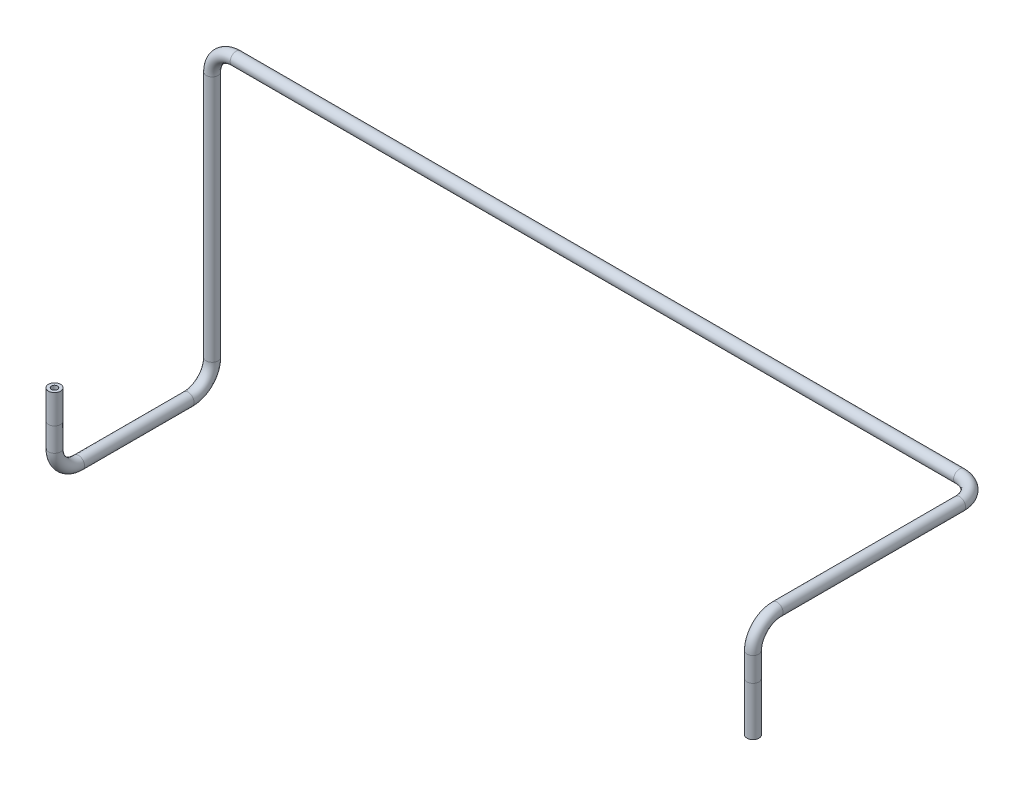
ISO-10303-21;
HEADER;
FILE_DESCRIPTION(('STEP AP214'),'2;1');
FILE_NAME('part.step','',(''),(''),'','','');
FILE_SCHEMA(('AUTOMOTIVE_DESIGN { 1 0 10303 214 1 1 1 1 }'));
ENDSEC;
DATA;
#1=APPLICATION_CONTEXT('core data for automotive mechanical design processes');
#2=APPLICATION_PROTOCOL_DEFINITION('international standard','automotive_design',2000,#1);
#3=PRODUCT_CONTEXT('',#1,'mechanical');
#4=PRODUCT('Part','Part','',(#3));
#5=PRODUCT_RELATED_PRODUCT_CATEGORY('part','',(#4));
#6=PRODUCT_DEFINITION_FORMATION('','',#4);
#7=PRODUCT_DEFINITION_CONTEXT('part definition',#1,'design');
#8=PRODUCT_DEFINITION('design','',#6,#7);
#9=PRODUCT_DEFINITION_SHAPE('','',#8);
#10=(LENGTH_UNIT() NAMED_UNIT(*) SI_UNIT(.MILLI.,.METRE.));
#11=(NAMED_UNIT(*) PLANE_ANGLE_UNIT() SI_UNIT($,.RADIAN.));
#12=(NAMED_UNIT(*) SI_UNIT($,.STERADIAN.) SOLID_ANGLE_UNIT());
#13=UNCERTAINTY_MEASURE_WITH_UNIT(LENGTH_MEASURE(1.E-05),#10,'distance_accuracy_value','');
#14=(GEOMETRIC_REPRESENTATION_CONTEXT(3) GLOBAL_UNCERTAINTY_ASSIGNED_CONTEXT((#13)) GLOBAL_UNIT_ASSIGNED_CONTEXT((#10,
#11,#12)) REPRESENTATION_CONTEXT('',''));
#15=CARTESIAN_POINT('',(0.,0.,0.));
#16=DIRECTION('',(0.,0.,1.));
#17=DIRECTION('',(1.,0.,0.));
#18=AXIS2_PLACEMENT_3D('',#15,#16,#17);
#19=CARTESIAN_POINT('',(5.78025894889841,28.154827009601,76.4051628992786));
#20=DIRECTION('',(0.,1.,0.));
#21=DIRECTION('',(0.,0.,1.));
#22=AXIS2_PLACEMENT_3D('',#19,#20,#21);
#23=CYLINDRICAL_SURFACE('',#22,1.58750000000001);
#24=CARTESIAN_POINT('',(5.78025894889841,41.021,76.4051628992786));
#25=DIRECTION('',(0.,1.,0.));
#26=DIRECTION('',(1.,0.,0.));
#27=AXIS2_PLACEMENT_3D('',#24,#25,#26);
#28=CIRCLE('',#27,1.58750000000001);
#29=CARTESIAN_POINT('',(7.36775894889842,41.021,76.4051628992786));
#30=VERTEX_POINT('',#29);
#31=EDGE_CURVE('E61',#30,#30,#28,.T.);
#32=ORIENTED_EDGE('',*,*,#31,.F.);
#33=EDGE_LOOP('',(#32));
#34=FACE_BOUND('',#33,.T.);
#35=CARTESIAN_POINT('',(5.78025894889841,28.154827009601,76.4051628992786));
#36=DIRECTION('',(0.,1.,0.));
#37=DIRECTION('',(1.,0.,0.));
#38=AXIS2_PLACEMENT_3D('',#35,#36,#37);
#39=CIRCLE('',#38,1.58750000000001);
#40=CARTESIAN_POINT('',(7.36775894889842,28.154827009601,76.4051628992786));
#41=VERTEX_POINT('',#40);
#42=EDGE_CURVE('E58',#41,#41,#39,.T.);
#43=ORIENTED_EDGE('',*,*,#42,.T.);
#44=EDGE_LOOP('',(#43));
#45=FACE_BOUND('',#44,.T.);
#46=ADVANCED_FACE('F37',(#34,#45),#23,.T.);
#47=CARTESIAN_POINT('',(5.78025894889841,41.021,76.4051628992786));
#48=DIRECTION('',(0.,1.,0.));
#49=DIRECTION('',(0.,0.,1.));
#50=AXIS2_PLACEMENT_3D('',#47,#48,#49);
#51=CYLINDRICAL_SURFACE('',#50,1.58750000000001);
#52=CARTESIAN_POINT('',(5.78025894889841,47.3856893309066,76.4051628992786));
#53=DIRECTION('',(0.,1.,0.));
#54=DIRECTION('',(1.,0.,0.));
#55=AXIS2_PLACEMENT_3D('',#52,#53,#54);
#56=CIRCLE('',#55,1.58750000000001);
#57=CARTESIAN_POINT('',(5.78025894889841,47.3856893309066,77.9926628992786));
#58=VERTEX_POINT('',#57);
#59=EDGE_CURVE('E64',#58,#58,#56,.T.);
#60=ORIENTED_EDGE('',*,*,#59,.F.);
#61=EDGE_LOOP('',(#60));
#62=FACE_BOUND('',#61,.T.);
#63=ORIENTED_EDGE('',*,*,#31,.T.);
#64=EDGE_LOOP('',(#63));
#65=FACE_BOUND('',#64,.T.);
#66=ADVANCED_FACE('F133',(#62,#65),#51,.T.);
#67=CARTESIAN_POINT('',(5.78025894889841,47.3856893309066,70.0551628992786));
#68=DIRECTION('',(-1.,0.,0.));
#69=DIRECTION('',(0.,0.,1.));
#70=AXIS2_PLACEMENT_3D('',#67,#68,#69);
#71=TOROIDAL_SURFACE('',#70,6.34999999999999,1.58750000000001);
#72=CARTESIAN_POINT('',(5.78025894889841,53.7356893309066,70.0551628992786));
#73=DIRECTION('',(0.,0.,-1.));
#74=DIRECTION('',(1.,0.,0.));
#75=AXIS2_PLACEMENT_3D('',#72,#73,#74);
#76=CIRCLE('',#75,1.58750000000001);
#77=CARTESIAN_POINT('',(5.78025894889841,55.3231893309066,70.0551628992786));
#78=VERTEX_POINT('',#77);
#79=EDGE_CURVE('E67',#78,#78,#76,.T.);
#80=CARTESIAN_POINT('',(5.78025894889841,47.3856893309066,70.0551628992786));
#81=DIRECTION('',(-1.,0.,0.));
#82=DIRECTION('',(0.,0.,1.));
#83=AXIS2_PLACEMENT_3D('',#80,#81,#82);
#84=CIRCLE('',#83,7.93750000000001);
#85=EDGE_CURVE('',#58,#78,#84,.T.);
#86=ORIENTED_EDGE('',*,*,#59,.T.);
#87=ORIENTED_EDGE('',*,*,#79,.F.);
#88=ORIENTED_EDGE('',*,*,#85,.T.);
#89=ORIENTED_EDGE('',*,*,#85,.F.);
#90=EDGE_LOOP('',(#86,#88,#87,#89));
#91=FACE_BOUND('',#90,.T.);
#92=ADVANCED_FACE('F137',(#91),#71,.T.);
#93=CARTESIAN_POINT('',(5.78025894889841,53.7356893309066,70.0551628992786));
#94=DIRECTION('',(0.,0.,-1.));
#95=DIRECTION('',(-1.,0.,0.));
#96=AXIS2_PLACEMENT_3D('',#93,#94,#95);
#97=CYLINDRICAL_SURFACE('',#96,1.58750000000001);
#98=CARTESIAN_POINT('',(5.78025894889841,53.7356893309066,21.8449999872787));
#99=DIRECTION('',(0.,0.,-1.));
#100=DIRECTION('',(1.,0.,0.));
#101=AXIS2_PLACEMENT_3D('',#98,#99,#100);
#102=CIRCLE('',#101,1.58750000000001);
#103=CARTESIAN_POINT('',(7.36775894889842,53.7356893309066,21.8449999872787));
#104=VERTEX_POINT('',#103);
#105=EDGE_CURVE('E70',#104,#104,#102,.T.);
#106=ORIENTED_EDGE('',*,*,#105,.F.);
#107=EDGE_LOOP('',(#106));
#108=FACE_BOUND('',#107,.T.);
#109=ORIENTED_EDGE('',*,*,#79,.T.);
#110=EDGE_LOOP('',(#109));
#111=FACE_BOUND('',#110,.T.);
#112=ADVANCED_FACE('F141',(#108,#111),#97,.T.);
#113=CARTESIAN_POINT('',(-0.569741051101594,53.7356893309066,21.8449999872787));
#114=DIRECTION('',(0.,1.,0.));
#115=DIRECTION('',(0.,0.,1.));
#116=AXIS2_PLACEMENT_3D('',#113,#114,#115);
#117=TOROIDAL_SURFACE('',#116,6.35,1.58750000000001);
#118=CARTESIAN_POINT('',(-0.569741051101607,53.7356893309066,15.4949999872787));
#119=DIRECTION('',(-1.,0.,0.));
#120=DIRECTION('',(0.,0.,-1.));
#121=AXIS2_PLACEMENT_3D('',#118,#119,#120);
#122=CIRCLE('',#121,1.58750000000001);
#123=CARTESIAN_POINT('',(-0.56974105110161,53.7356893309066,13.9074999872787));
#124=VERTEX_POINT('',#123);
#125=EDGE_CURVE('E73',#124,#124,#122,.T.);
#126=CARTESIAN_POINT('',(-0.569741051101594,53.7356893309066,21.8449999872787));
#127=DIRECTION('',(0.,1.,0.));
#128=DIRECTION('',(0.,0.,1.));
#129=AXIS2_PLACEMENT_3D('',#126,#127,#128);
#130=CIRCLE('',#129,7.93750000000001);
#131=EDGE_CURVE('',#104,#124,#130,.T.);
#132=ORIENTED_EDGE('',*,*,#105,.T.);
#133=ORIENTED_EDGE('',*,*,#125,.F.);
#134=ORIENTED_EDGE('',*,*,#131,.T.);
#135=ORIENTED_EDGE('',*,*,#131,.F.);
#136=EDGE_LOOP('',(#132,#134,#133,#135));
#137=FACE_BOUND('',#136,.T.);
#138=ADVANCED_FACE('F145',(#137),#117,.T.);
#139=CARTESIAN_POINT('',(-0.569741051101608,53.7356893309066,15.4949999872787));
#140=DIRECTION('',(-1.,0.,0.));
#141=DIRECTION('',(0.,0.,1.));
#142=AXIS2_PLACEMENT_3D('',#139,#140,#141);
#143=CYLINDRICAL_SURFACE('',#142,1.58750000000001);
#144=CARTESIAN_POINT('',(-191.589741051102,53.7356893309066,15.4949999872787));
#145=DIRECTION('',(-1.,0.,0.));
#146=DIRECTION('',(0.,0.,-1.));
#147=AXIS2_PLACEMENT_3D('',#144,#145,#146);
#148=CIRCLE('',#147,1.58750000000001);
#149=CARTESIAN_POINT('',(-191.589741051102,55.3231893309067,15.4949999872787));
#150=VERTEX_POINT('',#149);
#151=EDGE_CURVE('E76',#150,#150,#148,.T.);
#152=ORIENTED_EDGE('',*,*,#151,.F.);
#153=EDGE_LOOP('',(#152));
#154=FACE_BOUND('',#153,.T.);
#155=ORIENTED_EDGE('',*,*,#125,.T.);
#156=EDGE_LOOP('',(#155));
#157=FACE_BOUND('',#156,.T.);
#158=ADVANCED_FACE('F149',(#154,#157),#143,.T.);
#159=CARTESIAN_POINT('',(-191.589741051102,47.3856893309066,15.4949999872787));
#160=DIRECTION('',(0.,0.,1.));
#161=DIRECTION('',(1.,0.,0.));
#162=AXIS2_PLACEMENT_3D('',#159,#160,#161);
#163=TOROIDAL_SURFACE('',#162,6.35,1.58750000000001);
#164=CARTESIAN_POINT('',(-197.939741051102,47.3856893309066,15.4949999872787));
#165=DIRECTION('',(0.,-1.,0.));
#166=DIRECTION('',(0.,0.,-1.));
#167=AXIS2_PLACEMENT_3D('',#164,#165,#166);
#168=CIRCLE('',#167,1.58750000000001);
#169=CARTESIAN_POINT('',(-199.527241051102,47.3856893309066,15.4949999872787));
#170=VERTEX_POINT('',#169);
#171=EDGE_CURVE('E79',#170,#170,#168,.T.);
#172=CARTESIAN_POINT('',(-191.589741051102,47.3856893309066,15.4949999872787));
#173=DIRECTION('',(0.,0.,1.));
#174=DIRECTION('',(1.,0.,0.));
#175=AXIS2_PLACEMENT_3D('',#172,#173,#174);
#176=CIRCLE('',#175,7.93750000000001);
#177=EDGE_CURVE('',#150,#170,#176,.T.);
#178=ORIENTED_EDGE('',*,*,#151,.T.);
#179=ORIENTED_EDGE('',*,*,#171,.F.);
#180=ORIENTED_EDGE('',*,*,#177,.T.);
#181=ORIENTED_EDGE('',*,*,#177,.F.);
#182=EDGE_LOOP('',(#178,#180,#179,#181));
#183=FACE_BOUND('',#182,.T.);
#184=ADVANCED_FACE('F153',(#183),#163,.T.);
#185=CARTESIAN_POINT('',(-197.939741051102,47.3856893309066,15.4949999872787));
#186=DIRECTION('',(0.,-1.,0.));
#187=DIRECTION('',(0.,0.,-1.));
#188=AXIS2_PLACEMENT_3D('',#185,#186,#187);
#189=CYLINDRICAL_SURFACE('',#188,1.58750000000001);
#190=CARTESIAN_POINT('',(-197.939741051102,-17.8782461919388,15.4949999872787));
#191=DIRECTION('',(0.,-1.,0.));
#192=DIRECTION('',(0.,0.,-1.));
#193=AXIS2_PLACEMENT_3D('',#190,#191,#192);
#194=CIRCLE('',#193,1.58750000000001);
#195=CARTESIAN_POINT('',(-197.939741051102,-17.8782461919388,13.9074999872787));
#196=VERTEX_POINT('',#195);
#197=EDGE_CURVE('E82',#196,#196,#194,.T.);
#198=ORIENTED_EDGE('',*,*,#197,.F.);
#199=EDGE_LOOP('',(#198));
#200=FACE_BOUND('',#199,.T.);
#201=ORIENTED_EDGE('',*,*,#171,.T.);
#202=EDGE_LOOP('',(#201));
#203=FACE_BOUND('',#202,.T.);
#204=ADVANCED_FACE('F157',(#200,#203),#189,.T.);
#205=CARTESIAN_POINT('',(-197.939741051102,-17.8782461919388,21.8449999872787));
#206=DIRECTION('',(-1.,0.,0.));
#207=DIRECTION('',(0.,0.,1.));
#208=AXIS2_PLACEMENT_3D('',#205,#206,#207);
#209=TOROIDAL_SURFACE('',#208,6.35000000000001,1.58750000000001);
#210=CARTESIAN_POINT('',(-197.939741051102,-24.2282461919388,21.8449999872787));
#211=DIRECTION('',(0.,0.,1.));
#212=DIRECTION('',(0.,-1.,0.));
#213=AXIS2_PLACEMENT_3D('',#210,#211,#212);
#214=CIRCLE('',#213,1.58750000000001);
#215=CARTESIAN_POINT('',(-197.939741051102,-25.8157461919388,21.8449999872787));
#216=VERTEX_POINT('',#215);
#217=EDGE_CURVE('E85',#216,#216,#214,.T.);
#218=CARTESIAN_POINT('',(-197.939741051102,-17.8782461919388,21.8449999872787));
#219=DIRECTION('',(-1.,0.,0.));
#220=DIRECTION('',(0.,0.,1.));
#221=AXIS2_PLACEMENT_3D('',#218,#219,#220);
#222=CIRCLE('',#221,7.93750000000002);
#223=EDGE_CURVE('',#196,#216,#222,.T.);
#224=ORIENTED_EDGE('',*,*,#197,.T.);
#225=ORIENTED_EDGE('',*,*,#217,.F.);
#226=ORIENTED_EDGE('',*,*,#223,.T.);
#227=ORIENTED_EDGE('',*,*,#223,.F.);
#228=EDGE_LOOP('',(#224,#226,#225,#227));
#229=FACE_BOUND('',#228,.T.);
#230=ADVANCED_FACE('F161',(#229),#209,.T.);
#231=CARTESIAN_POINT('',(-197.939741051102,-24.2282461919388,21.8449999872787));
#232=DIRECTION('',(0.,0.,1.));
#233=DIRECTION('',(1.,0.,0.));
#234=AXIS2_PLACEMENT_3D('',#231,#232,#233);
#235=CYLINDRICAL_SURFACE('',#234,1.58750000000001);
#236=CARTESIAN_POINT('',(-197.939741051102,-24.2282461919388,50.7648628992787));
#237=DIRECTION('',(0.,0.,1.));
#238=DIRECTION('',(0.,-1.,0.));
#239=AXIS2_PLACEMENT_3D('',#236,#237,#238);
#240=CIRCLE('',#239,1.58750000000001);
#241=CARTESIAN_POINT('',(-197.939741051102,-25.8157461919388,50.7648628992787));
#242=VERTEX_POINT('',#241);
#243=EDGE_CURVE('E88',#242,#242,#240,.T.);
#244=ORIENTED_EDGE('',*,*,#243,.F.);
#245=EDGE_LOOP('',(#244));
#246=FACE_BOUND('',#245,.T.);
#247=ORIENTED_EDGE('',*,*,#217,.T.);
#248=EDGE_LOOP('',(#247));
#249=FACE_BOUND('',#248,.T.);
#250=ADVANCED_FACE('F107',(#246,#249),#235,.T.);
#251=CARTESIAN_POINT('',(-197.939741051102,-17.8782461919388,50.7648628992787));
#252=DIRECTION('',(-1.,0.,0.));
#253=DIRECTION('',(0.,0.,1.));
#254=AXIS2_PLACEMENT_3D('',#251,#252,#253);
#255=TOROIDAL_SURFACE('',#254,6.35,1.58750000000001);
#256=CARTESIAN_POINT('',(-197.939741051102,-17.8782461919393,57.1148628992787));
#257=DIRECTION('',(0.,1.,0.));
#258=DIRECTION('',(0.,0.,1.));
#259=AXIS2_PLACEMENT_3D('',#256,#257,#258);
#260=CIRCLE('',#259,1.58750000000001);
#261=CARTESIAN_POINT('',(-197.939741051102,-17.8782461919394,58.7023628992787));
#262=VERTEX_POINT('',#261);
#263=EDGE_CURVE('E90',#262,#262,#260,.T.);
#264=CARTESIAN_POINT('',(-197.939741051102,-17.8782461919388,50.7648628992787));
#265=DIRECTION('',(-1.,0.,0.));
#266=DIRECTION('',(0.,0.,1.));
#267=AXIS2_PLACEMENT_3D('',#264,#265,#266);
#268=CIRCLE('',#267,7.93750000000001);
#269=EDGE_CURVE('',#242,#262,#268,.T.);
#270=ORIENTED_EDGE('',*,*,#243,.T.);
#271=ORIENTED_EDGE('',*,*,#263,.F.);
#272=ORIENTED_EDGE('',*,*,#269,.T.);
#273=ORIENTED_EDGE('',*,*,#269,.F.);
#274=EDGE_LOOP('',(#270,#272,#271,#273));
#275=FACE_BOUND('',#274,.T.);
#276=ADVANCED_FACE('F100',(#275),#255,.T.);
#277=CARTESIAN_POINT('',(-197.939741051102,-17.8782461919399,57.1148628992787));
#278=DIRECTION('',(0.,1.,0.));
#279=DIRECTION('',(0.,0.,1.));
#280=AXIS2_PLACEMENT_3D('',#277,#278,#279);
#281=CYLINDRICAL_SURFACE('',#280,1.58750000000001);
#282=CARTESIAN_POINT('',(-197.939741051101,-11.6150000000012,57.1148628992788));
#283=DIRECTION('',(0.,1.,0.));
#284=DIRECTION('',(0.,0.,1.));
#285=AXIS2_PLACEMENT_3D('',#282,#283,#284);
#286=CIRCLE('',#285,1.58750000000001);
#287=CARTESIAN_POINT('',(-197.939741051101,-11.6150000000012,58.7023628992788));
#288=VERTEX_POINT('',#287);
#289=EDGE_CURVE('E41',#288,#288,#286,.T.);
#290=ORIENTED_EDGE('',*,*,#289,.F.);
#291=EDGE_LOOP('',(#290));
#292=FACE_BOUND('',#291,.T.);
#293=ORIENTED_EDGE('',*,*,#263,.T.);
#294=EDGE_LOOP('',(#293));
#295=FACE_BOUND('',#294,.T.);
#296=ADVANCED_FACE('F98',(#292,#295),#281,.T.);
#297=CARTESIAN_POINT('',(-197.939741051102,-11.615,57.1148628992787));
#298=DIRECTION('',(0.,1.,0.));
#299=DIRECTION('',(0.,0.,1.));
#300=AXIS2_PLACEMENT_3D('',#297,#298,#299);
#301=CYLINDRICAL_SURFACE('',#300,1.58750000000001);
#302=CARTESIAN_POINT('',(-197.939741051102,-3.99500000000002,57.1148628992787));
#303=DIRECTION('',(0.,1.,0.));
#304=DIRECTION('',(0.,0.,1.));
#305=AXIS2_PLACEMENT_3D('',#302,#303,#304);
#306=CIRCLE('',#305,1.58750000000001);
#307=CARTESIAN_POINT('',(-197.939741051102,-3.99500000000001,58.7023628992787));
#308=VERTEX_POINT('',#307);
#309=EDGE_CURVE('E54',#308,#308,#306,.T.);
#310=ORIENTED_EDGE('',*,*,#309,.F.);
#311=EDGE_LOOP('',(#310));
#312=FACE_BOUND('',#311,.T.);
#313=ORIENTED_EDGE('',*,*,#289,.T.);
#314=EDGE_LOOP('',(#313));
#315=FACE_BOUND('',#314,.T.);
#316=ADVANCED_FACE('F39',(#312,#315),#301,.T.);
#317=CARTESIAN_POINT('',(5.78025894889841,28.154827009601,76.4051628992786));
#318=DIRECTION('',(0.,1.,0.));
#319=DIRECTION('',(1.,0.,0.));
#320=AXIS2_PLACEMENT_3D('',#317,#318,#319);
#321=PLANE('',#320);
#322=CARTESIAN_POINT('',(5.78025894889841,28.154827009601,76.4051628992786));
#323=DIRECTION('',(0.,1.,0.));
#324=DIRECTION('',(1.,0.,0.));
#325=AXIS2_PLACEMENT_3D('',#322,#323,#324);
#326=CIRCLE('',#325,0.800100000000007);
#327=CARTESIAN_POINT('',(6.58035894889841,28.154827009601,76.4051628992786));
#328=VERTEX_POINT('',#327);
#329=EDGE_CURVE('E57',#328,#328,#326,.F.);
#330=ORIENTED_EDGE('',*,*,#329,.F.);
#331=EDGE_LOOP('',(#330));
#332=FACE_BOUND('',#331,.T.);
#333=ORIENTED_EDGE('',*,*,#42,.F.);
#334=EDGE_LOOP('',(#333));
#335=FACE_BOUND('',#334,.T.);
#336=ADVANCED_FACE('F105',(#332,#335),#321,.F.);
#337=CARTESIAN_POINT('',(-197.939741051102,-3.99500000000002,57.1148628992787));
#338=DIRECTION('',(0.,1.,0.));
#339=DIRECTION('',(0.,0.,1.));
#340=AXIS2_PLACEMENT_3D('',#337,#338,#339);
#341=PLANE('',#340);
#342=CARTESIAN_POINT('',(-197.939741051102,-3.99500000000002,57.1148628992787));
#343=DIRECTION('',(0.,1.,0.));
#344=DIRECTION('',(0.,0.,1.));
#345=AXIS2_PLACEMENT_3D('',#342,#343,#344);
#346=CIRCLE('',#345,0.800100000000007);
#347=CARTESIAN_POINT('',(-197.939741051102,-3.99500000000001,57.9149628992787));
#348=VERTEX_POINT('',#347);
#349=EDGE_CURVE('E10',#348,#348,#346,.F.);
#350=ORIENTED_EDGE('',*,*,#349,.T.);
#351=EDGE_LOOP('',(#350));
#352=FACE_BOUND('',#351,.T.);
#353=ORIENTED_EDGE('',*,*,#309,.T.);
#354=EDGE_LOOP('',(#353));
#355=FACE_BOUND('',#354,.T.);
#356=ADVANCED_FACE('F124',(#352,#355),#341,.T.);
#357=CARTESIAN_POINT('',(5.78025894889841,28.154827009601,76.4051628992786));
#358=DIRECTION('',(0.,1.,0.));
#359=DIRECTION('',(0.,0.,1.));
#360=AXIS2_PLACEMENT_3D('',#357,#358,#359);
#361=CYLINDRICAL_SURFACE('',#360,0.800100000000007);
#362=CARTESIAN_POINT('',(5.78025894889841,41.021,76.4051628992786));
#363=DIRECTION('',(0.,1.,0.));
#364=DIRECTION('',(1.,0.,0.));
#365=AXIS2_PLACEMENT_3D('',#362,#363,#364);
#366=CIRCLE('',#365,0.800100000000007);
#367=CARTESIAN_POINT('',(6.58035894889841,41.021,76.4051628992786));
#368=VERTEX_POINT('',#367);
#369=EDGE_CURVE('E374',#368,#368,#366,.F.);
#370=ORIENTED_EDGE('',*,*,#369,.F.);
#371=EDGE_LOOP('',(#370));
#372=FACE_BOUND('',#371,.T.);
#373=ORIENTED_EDGE('',*,*,#329,.T.);
#374=EDGE_LOOP('',(#373));
#375=FACE_BOUND('',#374,.T.);
#376=ADVANCED_FACE('F127',(#372,#375),#361,.F.);
#377=CARTESIAN_POINT('',(5.78025894889841,41.021,76.4051628992786));
#378=DIRECTION('',(0.,1.,0.));
#379=DIRECTION('',(0.,0.,1.));
#380=AXIS2_PLACEMENT_3D('',#377,#378,#379);
#381=CYLINDRICAL_SURFACE('',#380,0.800100000000007);
#382=CARTESIAN_POINT('',(5.78025894889841,47.3856893309066,76.4051628992786));
#383=DIRECTION('',(0.,1.,0.));
#384=DIRECTION('',(1.,0.,0.));
#385=AXIS2_PLACEMENT_3D('',#382,#383,#384);
#386=CIRCLE('',#385,0.800100000000007);
#387=CARTESIAN_POINT('',(5.78025894889841,47.3856893309066,77.2052628992786));
#388=VERTEX_POINT('',#387);
#389=EDGE_CURVE('E371',#388,#388,#386,.F.);
#390=ORIENTED_EDGE('',*,*,#389,.F.);
#391=EDGE_LOOP('',(#390));
#392=FACE_BOUND('',#391,.T.);
#393=ORIENTED_EDGE('',*,*,#369,.T.);
#394=EDGE_LOOP('',(#393));
#395=FACE_BOUND('',#394,.T.);
#396=ADVANCED_FACE('F230',(#392,#395),#381,.F.);
#397=CARTESIAN_POINT('',(5.78025894889841,47.3856893309066,70.0551628992786));
#398=DIRECTION('',(-1.,0.,0.));
#399=DIRECTION('',(0.,0.,1.));
#400=AXIS2_PLACEMENT_3D('',#397,#398,#399);
#401=TOROIDAL_SURFACE('',#400,6.34999999999999,0.800100000000007);
#402=CARTESIAN_POINT('',(5.78025894889841,53.7356893309066,70.0551628992786));
#403=DIRECTION('',(0.,0.,-1.));
#404=DIRECTION('',(1.,0.,0.));
#405=AXIS2_PLACEMENT_3D('',#402,#403,#404);
#406=CIRCLE('',#405,0.800100000000007);
#407=CARTESIAN_POINT('',(5.78025894889841,54.5357893309066,70.0551628992786));
#408=VERTEX_POINT('',#407);
#409=EDGE_CURVE('E368',#408,#408,#406,.F.);
#410=CARTESIAN_POINT('',(5.78025894889841,47.3856893309066,70.0551628992786));
#411=DIRECTION('',(-1.,0.,0.));
#412=DIRECTION('',(0.,0.,1.));
#413=AXIS2_PLACEMENT_3D('',#410,#411,#412);
#414=CIRCLE('',#413,7.1501);
#415=EDGE_CURVE('',#388,#408,#414,.T.);
#416=ORIENTED_EDGE('',*,*,#389,.T.);
#417=ORIENTED_EDGE('',*,*,#409,.F.);
#418=ORIENTED_EDGE('',*,*,#415,.T.);
#419=ORIENTED_EDGE('',*,*,#415,.F.);
#420=EDGE_LOOP('',(#416,#418,#417,#419));
#421=FACE_BOUND('',#420,.T.);
#422=ADVANCED_FACE('F240',(#421),#401,.F.);
#423=CARTESIAN_POINT('',(5.78025894889841,53.7356893309066,70.0551628992786));
#424=DIRECTION('',(0.,0.,-1.));
#425=DIRECTION('',(-1.,0.,0.));
#426=AXIS2_PLACEMENT_3D('',#423,#424,#425);
#427=CYLINDRICAL_SURFACE('',#426,0.800100000000007);
#428=CARTESIAN_POINT('',(5.78025894889841,53.7356893309066,21.8449999872787));
#429=DIRECTION('',(0.,0.,-1.));
#430=DIRECTION('',(1.,0.,0.));
#431=AXIS2_PLACEMENT_3D('',#428,#429,#430);
#432=CIRCLE('',#431,0.800100000000007);
#433=CARTESIAN_POINT('',(6.58035894889841,53.7356893309066,21.8449999872787));
#434=VERTEX_POINT('',#433);
#435=EDGE_CURVE('E365',#434,#434,#432,.F.);
#436=ORIENTED_EDGE('',*,*,#435,.F.);
#437=EDGE_LOOP('',(#436));
#438=FACE_BOUND('',#437,.T.);
#439=ORIENTED_EDGE('',*,*,#409,.T.);
#440=EDGE_LOOP('',(#439));
#441=FACE_BOUND('',#440,.T.);
#442=ADVANCED_FACE('F250',(#438,#441),#427,.F.);
#443=CARTESIAN_POINT('',(-0.569741051101594,53.7356893309066,21.8449999872787));
#444=DIRECTION('',(0.,1.,0.));
#445=DIRECTION('',(0.,0.,1.));
#446=AXIS2_PLACEMENT_3D('',#443,#444,#445);
#447=TOROIDAL_SURFACE('',#446,6.35,0.800100000000007);
#448=CARTESIAN_POINT('',(-0.569741051101607,53.7356893309066,15.4949999872787));
#449=DIRECTION('',(-1.,0.,0.));
#450=DIRECTION('',(0.,0.,-1.));
#451=AXIS2_PLACEMENT_3D('',#448,#449,#450);
#452=CIRCLE('',#451,0.800100000000007);
#453=CARTESIAN_POINT('',(-0.569741051101608,53.7356893309066,14.6948999872787));
#454=VERTEX_POINT('',#453);
#455=EDGE_CURVE('E362',#454,#454,#452,.F.);
#456=CARTESIAN_POINT('',(-0.569741051101594,53.7356893309066,21.8449999872787));
#457=DIRECTION('',(0.,1.,0.));
#458=DIRECTION('',(0.,0.,1.));
#459=AXIS2_PLACEMENT_3D('',#456,#457,#458);
#460=CIRCLE('',#459,7.15010000000001);
#461=EDGE_CURVE('',#434,#454,#460,.T.);
#462=ORIENTED_EDGE('',*,*,#435,.T.);
#463=ORIENTED_EDGE('',*,*,#455,.F.);
#464=ORIENTED_EDGE('',*,*,#461,.T.);
#465=ORIENTED_EDGE('',*,*,#461,.F.);
#466=EDGE_LOOP('',(#462,#464,#463,#465));
#467=FACE_BOUND('',#466,.T.);
#468=ADVANCED_FACE('F260',(#467),#447,.F.);
#469=CARTESIAN_POINT('',(-0.569741051101608,53.7356893309066,15.4949999872787));
#470=DIRECTION('',(-1.,0.,0.));
#471=DIRECTION('',(0.,0.,1.));
#472=AXIS2_PLACEMENT_3D('',#469,#470,#471);
#473=CYLINDRICAL_SURFACE('',#472,0.800100000000007);
#474=CARTESIAN_POINT('',(-191.589741051102,53.7356893309066,15.4949999872787));
#475=DIRECTION('',(-1.,0.,0.));
#476=DIRECTION('',(0.,0.,-1.));
#477=AXIS2_PLACEMENT_3D('',#474,#475,#476);
#478=CIRCLE('',#477,0.800100000000007);
#479=CARTESIAN_POINT('',(-191.589741051102,54.5357893309066,15.4949999872787));
#480=VERTEX_POINT('',#479);
#481=EDGE_CURVE('E359',#480,#480,#478,.F.);
#482=ORIENTED_EDGE('',*,*,#481,.F.);
#483=EDGE_LOOP('',(#482));
#484=FACE_BOUND('',#483,.T.);
#485=ORIENTED_EDGE('',*,*,#455,.T.);
#486=EDGE_LOOP('',(#485));
#487=FACE_BOUND('',#486,.T.);
#488=ADVANCED_FACE('F270',(#484,#487),#473,.F.);
#489=CARTESIAN_POINT('',(-191.589741051102,47.3856893309066,15.4949999872787));
#490=DIRECTION('',(0.,0.,1.));
#491=DIRECTION('',(1.,0.,0.));
#492=AXIS2_PLACEMENT_3D('',#489,#490,#491);
#493=TOROIDAL_SURFACE('',#492,6.35,0.800100000000007);
#494=CARTESIAN_POINT('',(-197.939741051102,47.3856893309066,15.4949999872787));
#495=DIRECTION('',(0.,-1.,0.));
#496=DIRECTION('',(0.,0.,-1.));
#497=AXIS2_PLACEMENT_3D('',#494,#495,#496);
#498=CIRCLE('',#497,0.800100000000007);
#499=CARTESIAN_POINT('',(-198.739841051102,47.3856893309066,15.4949999872787));
#500=VERTEX_POINT('',#499);
#501=EDGE_CURVE('E356',#500,#500,#498,.F.);
#502=CARTESIAN_POINT('',(-191.589741051102,47.3856893309066,15.4949999872787));
#503=DIRECTION('',(0.,0.,1.));
#504=DIRECTION('',(1.,0.,0.));
#505=AXIS2_PLACEMENT_3D('',#502,#503,#504);
#506=CIRCLE('',#505,7.15010000000001);
#507=EDGE_CURVE('',#480,#500,#506,.T.);
#508=ORIENTED_EDGE('',*,*,#481,.T.);
#509=ORIENTED_EDGE('',*,*,#501,.F.);
#510=ORIENTED_EDGE('',*,*,#507,.T.);
#511=ORIENTED_EDGE('',*,*,#507,.F.);
#512=EDGE_LOOP('',(#508,#510,#509,#511));
#513=FACE_BOUND('',#512,.T.);
#514=ADVANCED_FACE('F280',(#513),#493,.F.);
#515=CARTESIAN_POINT('',(-197.939741051102,47.3856893309066,15.4949999872787));
#516=DIRECTION('',(0.,-1.,0.));
#517=DIRECTION('',(0.,0.,-1.));
#518=AXIS2_PLACEMENT_3D('',#515,#516,#517);
#519=CYLINDRICAL_SURFACE('',#518,0.800100000000007);
#520=CARTESIAN_POINT('',(-197.939741051102,-17.8782461919388,15.4949999872787));
#521=DIRECTION('',(0.,-1.,0.));
#522=DIRECTION('',(0.,0.,-1.));
#523=AXIS2_PLACEMENT_3D('',#520,#521,#522);
#524=CIRCLE('',#523,0.800100000000007);
#525=CARTESIAN_POINT('',(-197.939741051102,-17.8782461919388,14.6948999872787));
#526=VERTEX_POINT('',#525);
#527=EDGE_CURVE('E351',#526,#526,#524,.F.);
#528=ORIENTED_EDGE('',*,*,#527,.F.);
#529=EDGE_LOOP('',(#528));
#530=FACE_BOUND('',#529,.T.);
#531=ORIENTED_EDGE('',*,*,#501,.T.);
#532=EDGE_LOOP('',(#531));
#533=FACE_BOUND('',#532,.T.);
#534=ADVANCED_FACE('F290',(#530,#533),#519,.F.);
#535=CARTESIAN_POINT('',(-197.939741051102,-17.8782461919388,21.8449999872787));
#536=DIRECTION('',(-1.,0.,0.));
#537=DIRECTION('',(0.,0.,1.));
#538=AXIS2_PLACEMENT_3D('',#535,#536,#537);
#539=TOROIDAL_SURFACE('',#538,6.35000000000001,0.800100000000007);
#540=CARTESIAN_POINT('',(-197.939741051102,-24.2282461919388,21.8449999872787));
#541=DIRECTION('',(0.,0.,1.));
#542=DIRECTION('',(0.,-1.,0.));
#543=AXIS2_PLACEMENT_3D('',#540,#541,#542);
#544=CIRCLE('',#543,0.800100000000007);
#545=CARTESIAN_POINT('',(-197.939741051102,-25.0283461919388,21.8449999872787));
#546=VERTEX_POINT('',#545);
#547=EDGE_CURVE('E348',#546,#546,#544,.F.);
#548=CARTESIAN_POINT('',(-197.939741051102,-17.8782461919388,21.8449999872787));
#549=DIRECTION('',(-1.,0.,0.));
#550=DIRECTION('',(0.,0.,1.));
#551=AXIS2_PLACEMENT_3D('',#548,#549,#550);
#552=CIRCLE('',#551,7.15010000000002);
#553=EDGE_CURVE('',#526,#546,#552,.T.);
#554=ORIENTED_EDGE('',*,*,#527,.T.);
#555=ORIENTED_EDGE('',*,*,#547,.F.);
#556=ORIENTED_EDGE('',*,*,#553,.T.);
#557=ORIENTED_EDGE('',*,*,#553,.F.);
#558=EDGE_LOOP('',(#554,#556,#555,#557));
#559=FACE_BOUND('',#558,.T.);
#560=ADVANCED_FACE('F300',(#559),#539,.F.);
#561=CARTESIAN_POINT('',(-197.939741051102,-24.2282461919388,21.8449999872787));
#562=DIRECTION('',(0.,0.,1.));
#563=DIRECTION('',(1.,0.,0.));
#564=AXIS2_PLACEMENT_3D('',#561,#562,#563);
#565=CYLINDRICAL_SURFACE('',#564,0.800100000000007);
#566=CARTESIAN_POINT('',(-197.939741051102,-24.2282461919388,50.7648628992787));
#567=DIRECTION('',(0.,0.,1.));
#568=DIRECTION('',(0.,-1.,0.));
#569=AXIS2_PLACEMENT_3D('',#566,#567,#568);
#570=CIRCLE('',#569,0.800100000000007);
#571=CARTESIAN_POINT('',(-197.939741051102,-25.0283461919388,50.7648628992787));
#572=VERTEX_POINT('',#571);
#573=EDGE_CURVE('E347',#572,#572,#570,.F.);
#574=ORIENTED_EDGE('',*,*,#573,.F.);
#575=EDGE_LOOP('',(#574));
#576=FACE_BOUND('',#575,.T.);
#577=ORIENTED_EDGE('',*,*,#547,.T.);
#578=EDGE_LOOP('',(#577));
#579=FACE_BOUND('',#578,.T.);
#580=ADVANCED_FACE('F310',(#576,#579),#565,.F.);
#581=CARTESIAN_POINT('',(-197.939741051102,-17.8782461919388,50.7648628992787));
#582=DIRECTION('',(-1.,0.,0.));
#583=DIRECTION('',(0.,0.,1.));
#584=AXIS2_PLACEMENT_3D('',#581,#582,#583);
#585=TOROIDAL_SURFACE('',#584,6.35,0.800100000000007);
#586=CARTESIAN_POINT('',(-197.939741051102,-17.8782461919393,57.1148628992787));
#587=DIRECTION('',(0.,1.,0.));
#588=DIRECTION('',(0.,0.,1.));
#589=AXIS2_PLACEMENT_3D('',#586,#587,#588);
#590=CIRCLE('',#589,0.800100000000007);
#591=CARTESIAN_POINT('',(-197.939741051102,-17.8782461919393,57.9149628992787));
#592=VERTEX_POINT('',#591);
#593=EDGE_CURVE('E50',#592,#592,#590,.F.);
#594=CARTESIAN_POINT('',(-197.939741051102,-17.8782461919388,50.7648628992787));
#595=DIRECTION('',(-1.,0.,0.));
#596=DIRECTION('',(0.,0.,1.));
#597=AXIS2_PLACEMENT_3D('',#594,#595,#596);
#598=CIRCLE('',#597,7.15010000000001);
#599=EDGE_CURVE('',#572,#592,#598,.T.);
#600=ORIENTED_EDGE('',*,*,#573,.T.);
#601=ORIENTED_EDGE('',*,*,#593,.F.);
#602=ORIENTED_EDGE('',*,*,#599,.T.);
#603=ORIENTED_EDGE('',*,*,#599,.F.);
#604=EDGE_LOOP('',(#600,#602,#601,#603));
#605=FACE_BOUND('',#604,.T.);
#606=ADVANCED_FACE('F118',(#605),#585,.F.);
#607=CARTESIAN_POINT('',(-197.939741051102,-17.8782461919399,57.1148628992787));
#608=DIRECTION('',(0.,1.,0.));
#609=DIRECTION('',(0.,0.,1.));
#610=AXIS2_PLACEMENT_3D('',#607,#608,#609);
#611=CYLINDRICAL_SURFACE('',#610,0.800100000000007);
#612=CARTESIAN_POINT('',(-197.939741051101,-11.6150000000012,57.1148628992788));
#613=DIRECTION('',(0.,1.,0.));
#614=DIRECTION('',(0.,0.,1.));
#615=AXIS2_PLACEMENT_3D('',#612,#613,#614);
#616=CIRCLE('',#615,0.800100000000007);
#617=CARTESIAN_POINT('',(-197.939741051101,-11.6150000000012,57.9149628992788));
#618=VERTEX_POINT('',#617);
#619=EDGE_CURVE('E45',#618,#618,#616,.F.);
#620=ORIENTED_EDGE('',*,*,#619,.F.);
#621=EDGE_LOOP('',(#620));
#622=FACE_BOUND('',#621,.T.);
#623=ORIENTED_EDGE('',*,*,#593,.T.);
#624=EDGE_LOOP('',(#623));
#625=FACE_BOUND('',#624,.T.);
#626=ADVANCED_FACE('F112',(#622,#625),#611,.F.);
#627=CARTESIAN_POINT('',(-197.939741051102,-11.615,57.1148628992787));
#628=DIRECTION('',(0.,1.,0.));
#629=DIRECTION('',(0.,0.,1.));
#630=AXIS2_PLACEMENT_3D('',#627,#628,#629);
#631=CYLINDRICAL_SURFACE('',#630,0.800100000000007);
#632=ORIENTED_EDGE('',*,*,#349,.F.);
#633=EDGE_LOOP('',(#632));
#634=FACE_BOUND('',#633,.T.);
#635=ORIENTED_EDGE('',*,*,#619,.T.);
#636=EDGE_LOOP('',(#635));
#637=FACE_BOUND('',#636,.T.);
#638=ADVANCED_FACE('F110',(#634,#637),#631,.F.);
#639=CLOSED_SHELL('',(#46,#66,#92,#112,#138,#158,#184,#204,#230,#250,#276,#296,#316,#336,#356,
#376,#396,#422,#442,#468,#488,#514,#534,#560,#580,#606,#626,#638));
#640=MANIFOLD_SOLID_BREP('B2',#639);
#641=ADVANCED_BREP_SHAPE_REPRESENTATION('',(#18,#640),#14);
#642=SHAPE_DEFINITION_REPRESENTATION(#9,#641);
ENDSEC;
END-ISO-10303-21;
